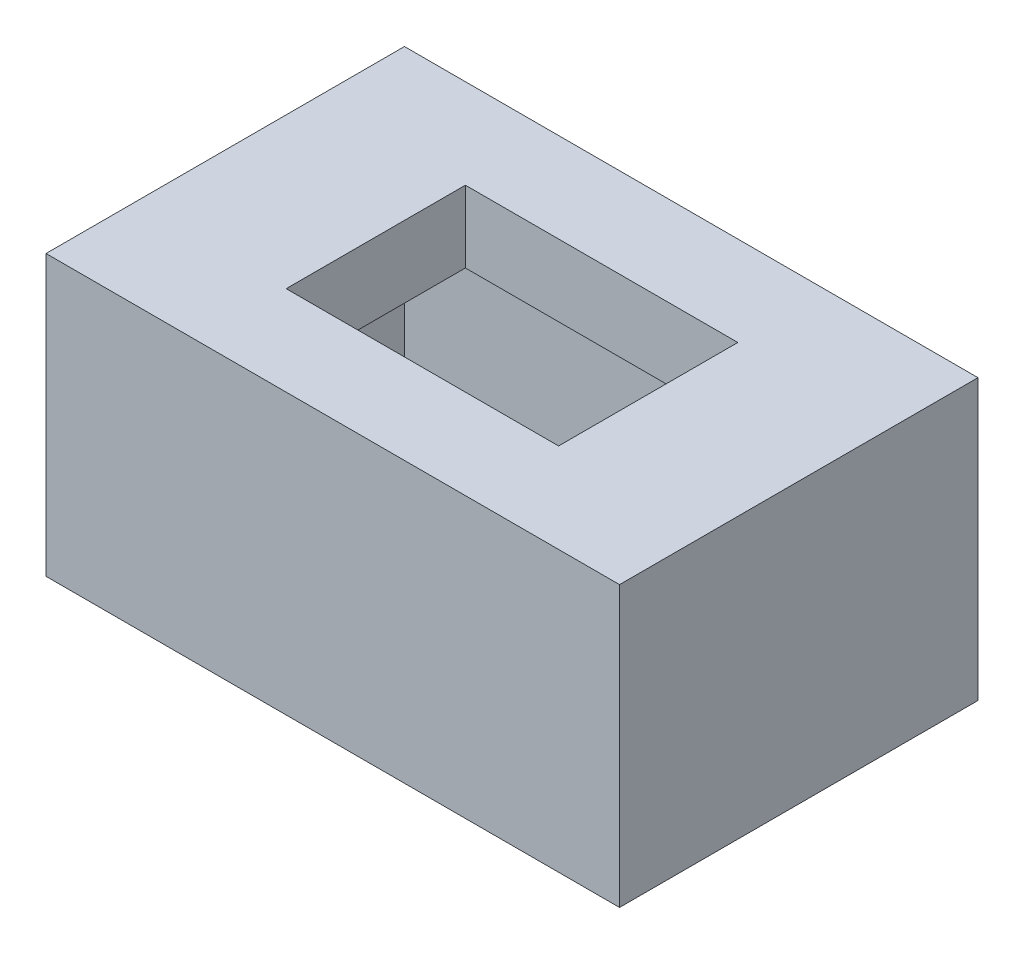
ISO-10303-21;
HEADER;
FILE_DESCRIPTION(('STEP AP214'),'2;1');
FILE_NAME('part.step','',(''),(''),'','','');
FILE_SCHEMA(('AUTOMOTIVE_DESIGN { 1 0 10303 214 1 1 1 1 }'));
ENDSEC;
DATA;
#1=APPLICATION_CONTEXT('core data for automotive mechanical design processes');
#2=APPLICATION_PROTOCOL_DEFINITION('international standard','automotive_design',2000,#1);
#3=PRODUCT_CONTEXT('',#1,'mechanical');
#4=PRODUCT('Part','Part','',(#3));
#5=PRODUCT_RELATED_PRODUCT_CATEGORY('part','',(#4));
#6=PRODUCT_DEFINITION_FORMATION('','',#4);
#7=PRODUCT_DEFINITION_CONTEXT('part definition',#1,'design');
#8=PRODUCT_DEFINITION('design','',#6,#7);
#9=PRODUCT_DEFINITION_SHAPE('','',#8);
#10=(LENGTH_UNIT() NAMED_UNIT(*) SI_UNIT(.MILLI.,.METRE.));
#11=(NAMED_UNIT(*) PLANE_ANGLE_UNIT() SI_UNIT($,.RADIAN.));
#12=(NAMED_UNIT(*) SI_UNIT($,.STERADIAN.) SOLID_ANGLE_UNIT());
#13=UNCERTAINTY_MEASURE_WITH_UNIT(LENGTH_MEASURE(1.E-05),#10,'distance_accuracy_value','');
#14=(GEOMETRIC_REPRESENTATION_CONTEXT(3) GLOBAL_UNCERTAINTY_ASSIGNED_CONTEXT((#13)) GLOBAL_UNIT_ASSIGNED_CONTEXT((#10,
#11,#12)) REPRESENTATION_CONTEXT('',''));
#15=CARTESIAN_POINT('',(0.,0.,0.));
#16=DIRECTION('',(0.,0.,1.));
#17=DIRECTION('',(1.,0.,0.));
#18=AXIS2_PLACEMENT_3D('',#15,#16,#17);
#19=CARTESIAN_POINT('',(40.,40.,-25.));
#20=DIRECTION('',(-1.,0.,0.));
#21=DIRECTION('',(0.,0.,1.));
#22=AXIS2_PLACEMENT_3D('',#19,#20,#21);
#23=PLANE('',#22);
#24=DIRECTION('',(0.,0.,1.));
#25=VECTOR('',#24,1.);
#26=CARTESIAN_POINT('',(40.,1.,-25.));
#27=LINE('',#26,#25);
#28=CARTESIAN_POINT('',(40.,1.,-25.));
#29=VERTEX_POINT('',#28);
#30=CARTESIAN_POINT('',(40.,1.,25.));
#31=VERTEX_POINT('',#30);
#32=EDGE_CURVE('E56',#29,#31,#27,.T.);
#33=ORIENTED_EDGE('',*,*,#32,.F.);
#34=DIRECTION('',(0.,-1.,0.));
#35=VECTOR('',#34,1.);
#36=CARTESIAN_POINT('',(40.,40.,-25.));
#37=LINE('',#36,#35);
#38=CARTESIAN_POINT('',(40.,40.,-25.));
#39=VERTEX_POINT('',#38);
#40=EDGE_CURVE('E313',#39,#29,#37,.T.);
#41=ORIENTED_EDGE('',*,*,#40,.F.);
#42=DIRECTION('',(0.,0.,-1.));
#43=VECTOR('',#42,1.);
#44=CARTESIAN_POINT('',(40.,40.,-25.));
#45=LINE('',#44,#43);
#46=CARTESIAN_POINT('',(40.,40.,25.));
#47=VERTEX_POINT('',#46);
#48=EDGE_CURVE('E279',#47,#39,#45,.T.);
#49=ORIENTED_EDGE('',*,*,#48,.F.);
#50=DIRECTION('',(0.,-1.,0.));
#51=VECTOR('',#50,1.);
#52=CARTESIAN_POINT('',(40.,40.,25.));
#53=LINE('',#52,#51);
#54=EDGE_CURVE('E301',#47,#31,#53,.T.);
#55=ORIENTED_EDGE('',*,*,#54,.T.);
#56=EDGE_LOOP('',(#33,#41,#49,#55));
#57=FACE_BOUND('',#56,.T.);
#58=ADVANCED_FACE('F41',(#57),#23,.F.);
#59=CARTESIAN_POINT('',(-40.,40.,-25.));
#60=DIRECTION('',(0.,0.,1.));
#61=DIRECTION('',(1.,0.,0.));
#62=AXIS2_PLACEMENT_3D('',#59,#60,#61);
#63=PLANE('',#62);
#64=DIRECTION('',(1.,0.,0.));
#65=VECTOR('',#64,1.);
#66=CARTESIAN_POINT('',(-40.,1.,-25.));
#67=LINE('',#66,#65);
#68=CARTESIAN_POINT('',(-40.,1.,-25.));
#69=VERTEX_POINT('',#68);
#70=EDGE_CURVE('E200',#69,#29,#67,.T.);
#71=ORIENTED_EDGE('',*,*,#70,.F.);
#72=DIRECTION('',(0.,-1.,0.));
#73=VECTOR('',#72,1.);
#74=CARTESIAN_POINT('',(-40.,40.,-25.));
#75=LINE('',#74,#73);
#76=CARTESIAN_POINT('',(-40.,40.,-25.));
#77=VERTEX_POINT('',#76);
#78=EDGE_CURVE('E309',#77,#69,#75,.T.);
#79=ORIENTED_EDGE('',*,*,#78,.F.);
#80=DIRECTION('',(-1.,0.,0.));
#81=VECTOR('',#80,1.);
#82=CARTESIAN_POINT('',(-40.,40.,-25.));
#83=LINE('',#82,#81);
#84=EDGE_CURVE('E292',#39,#77,#83,.T.);
#85=ORIENTED_EDGE('',*,*,#84,.F.);
#86=ORIENTED_EDGE('',*,*,#40,.T.);
#87=EDGE_LOOP('',(#71,#79,#85,#86));
#88=FACE_BOUND('',#87,.T.);
#89=ADVANCED_FACE('F361',(#88),#63,.F.);
#90=CARTESIAN_POINT('',(-40.,40.,-25.));
#91=DIRECTION('',(1.,0.,0.));
#92=DIRECTION('',(0.,0.,-1.));
#93=AXIS2_PLACEMENT_3D('',#90,#91,#92);
#94=PLANE('',#93);
#95=DIRECTION('',(0.,0.,-1.));
#96=VECTOR('',#95,1.);
#97=CARTESIAN_POINT('',(-40.,1.,25.));
#98=LINE('',#97,#96);
#99=CARTESIAN_POINT('',(-40.,1.,25.));
#100=VERTEX_POINT('',#99);
#101=EDGE_CURVE('E213',#100,#69,#98,.T.);
#102=ORIENTED_EDGE('',*,*,#101,.F.);
#103=DIRECTION('',(0.,-1.,0.));
#104=VECTOR('',#103,1.);
#105=CARTESIAN_POINT('',(-40.,40.,25.));
#106=LINE('',#105,#104);
#107=CARTESIAN_POINT('',(-40.,40.,25.));
#108=VERTEX_POINT('',#107);
#109=EDGE_CURVE('E305',#108,#100,#106,.T.);
#110=ORIENTED_EDGE('',*,*,#109,.F.);
#111=DIRECTION('',(0.,0.,1.));
#112=VECTOR('',#111,1.);
#113=CARTESIAN_POINT('',(-40.,40.,-25.));
#114=LINE('',#113,#112);
#115=EDGE_CURVE('E295',#77,#108,#114,.T.);
#116=ORIENTED_EDGE('',*,*,#115,.F.);
#117=ORIENTED_EDGE('',*,*,#78,.T.);
#118=EDGE_LOOP('',(#102,#110,#116,#117));
#119=FACE_BOUND('',#118,.T.);
#120=ADVANCED_FACE('F366',(#119),#94,.F.);
#121=CARTESIAN_POINT('',(-40.,40.,25.));
#122=DIRECTION('',(0.,0.,-1.));
#123=DIRECTION('',(-1.,0.,0.));
#124=AXIS2_PLACEMENT_3D('',#121,#122,#123);
#125=PLANE('',#124);
#126=DIRECTION('',(-1.,0.,0.));
#127=VECTOR('',#126,1.);
#128=CARTESIAN_POINT('',(40.,1.,25.));
#129=LINE('',#128,#127);
#130=EDGE_CURVE('E210',#31,#100,#129,.T.);
#131=ORIENTED_EDGE('',*,*,#130,.F.);
#132=ORIENTED_EDGE('',*,*,#54,.F.);
#133=DIRECTION('',(1.,0.,0.));
#134=VECTOR('',#133,1.);
#135=CARTESIAN_POINT('',(-40.,40.,25.));
#136=LINE('',#135,#134);
#137=EDGE_CURVE('E298',#108,#47,#136,.T.);
#138=ORIENTED_EDGE('',*,*,#137,.F.);
#139=ORIENTED_EDGE('',*,*,#109,.T.);
#140=EDGE_LOOP('',(#131,#132,#138,#139));
#141=FACE_BOUND('',#140,.T.);
#142=ADVANCED_FACE('F368',(#141),#125,.F.);
#143=CARTESIAN_POINT('',(0.,0.,0.));
#144=DIRECTION('',(0.,1.,0.));
#145=DIRECTION('',(0.,0.,1.));
#146=AXIS2_PLACEMENT_3D('',#143,#144,#145);
#147=PLANE('',#146);
#148=DIRECTION('',(0.,0.,1.));
#149=VECTOR('',#148,1.);
#150=CARTESIAN_POINT('',(35.,0.,-20.));
#151=LINE('',#150,#149);
#152=CARTESIAN_POINT('',(35.,0.,-20.));
#153=VERTEX_POINT('',#152);
#154=CARTESIAN_POINT('',(35.,0.,20.));
#155=VERTEX_POINT('',#154);
#156=EDGE_CURVE('E265',#153,#155,#151,.T.);
#157=ORIENTED_EDGE('',*,*,#156,.F.);
#158=DIRECTION('',(1.,0.,0.));
#159=VECTOR('',#158,1.);
#160=CARTESIAN_POINT('',(-35.,0.,-20.));
#161=LINE('',#160,#159);
#162=CARTESIAN_POINT('',(-35.,0.,-20.));
#163=VERTEX_POINT('',#162);
#164=EDGE_CURVE('E235',#163,#153,#161,.T.);
#165=ORIENTED_EDGE('',*,*,#164,.F.);
#166=DIRECTION('',(0.,0.,-1.));
#167=VECTOR('',#166,1.);
#168=CARTESIAN_POINT('',(-35.,0.,20.));
#169=LINE('',#168,#167);
#170=CARTESIAN_POINT('',(-35.,0.,20.));
#171=VERTEX_POINT('',#170);
#172=EDGE_CURVE('E250',#171,#163,#169,.T.);
#173=ORIENTED_EDGE('',*,*,#172,.F.);
#174=DIRECTION('',(-1.,0.,0.));
#175=VECTOR('',#174,1.);
#176=CARTESIAN_POINT('',(35.,0.,20.));
#177=LINE('',#176,#175);
#178=EDGE_CURVE('E269',#155,#171,#177,.T.);
#179=ORIENTED_EDGE('',*,*,#178,.F.);
#180=EDGE_LOOP('',(#157,#165,#173,#179));
#181=FACE_BOUND('',#180,.T.);
#182=DIRECTION('',(1.,0.,0.));
#183=VECTOR('',#182,1.);
#184=CARTESIAN_POINT('',(-37.5,0.,-22.5));
#185=LINE('',#184,#183);
#186=CARTESIAN_POINT('',(-37.5,0.,-22.5));
#187=VERTEX_POINT('',#186);
#188=CARTESIAN_POINT('',(37.5,0.,-22.5));
#189=VERTEX_POINT('',#188);
#190=EDGE_CURVE('E191',#187,#189,#185,.T.);
#191=ORIENTED_EDGE('',*,*,#190,.T.);
#192=DIRECTION('',(0.,0.,1.));
#193=VECTOR('',#192,1.);
#194=CARTESIAN_POINT('',(37.5,0.,-22.5));
#195=LINE('',#194,#193);
#196=CARTESIAN_POINT('',(37.5,0.,22.5));
#197=VERTEX_POINT('',#196);
#198=EDGE_CURVE('E159',#189,#197,#195,.T.);
#199=ORIENTED_EDGE('',*,*,#198,.T.);
#200=DIRECTION('',(-1.,0.,0.));
#201=VECTOR('',#200,1.);
#202=CARTESIAN_POINT('',(37.5,0.,22.5));
#203=LINE('',#202,#201);
#204=CARTESIAN_POINT('',(-37.5,0.,22.5));
#205=VERTEX_POINT('',#204);
#206=EDGE_CURVE('E64',#197,#205,#203,.T.);
#207=ORIENTED_EDGE('',*,*,#206,.T.);
#208=DIRECTION('',(0.,0.,-1.));
#209=VECTOR('',#208,1.);
#210=CARTESIAN_POINT('',(-37.5,0.,22.5));
#211=LINE('',#210,#209);
#212=EDGE_CURVE('E181',#205,#187,#211,.T.);
#213=ORIENTED_EDGE('',*,*,#212,.T.);
#214=EDGE_LOOP('',(#191,#199,#207,#213));
#215=FACE_BOUND('',#214,.T.);
#216=ADVANCED_FACE('F351',(#181,#215),#147,.F.);
#217=CARTESIAN_POINT('',(0.,40.,0.));
#218=DIRECTION('',(0.,1.,0.));
#219=DIRECTION('',(0.,0.,1.));
#220=AXIS2_PLACEMENT_3D('',#217,#218,#219);
#221=PLANE('',#220);
#222=DIRECTION('',(0.,0.,-1.));
#223=VECTOR('',#222,1.);
#224=CARTESIAN_POINT('',(19.,40.,12.5));
#225=LINE('',#224,#223);
#226=CARTESIAN_POINT('',(19.,40.,12.5));
#227=VERTEX_POINT('',#226);
#228=CARTESIAN_POINT('',(19.,40.,-12.5));
#229=VERTEX_POINT('',#228);
#230=EDGE_CURVE('E216',#227,#229,#225,.T.);
#231=ORIENTED_EDGE('',*,*,#230,.F.);
#232=DIRECTION('',(1.,0.,0.));
#233=VECTOR('',#232,1.);
#234=CARTESIAN_POINT('',(-19.,40.,12.5));
#235=LINE('',#234,#233);
#236=CARTESIAN_POINT('',(-19.,40.,12.5));
#237=VERTEX_POINT('',#236);
#238=EDGE_CURVE('E227',#237,#227,#235,.T.);
#239=ORIENTED_EDGE('',*,*,#238,.F.);
#240=DIRECTION('',(0.,0.,1.));
#241=VECTOR('',#240,1.);
#242=CARTESIAN_POINT('',(-19.,40.,12.5));
#243=LINE('',#242,#241);
#244=CARTESIAN_POINT('',(-19.,40.,-12.5));
#245=VERTEX_POINT('',#244);
#246=EDGE_CURVE('E223',#245,#237,#243,.T.);
#247=ORIENTED_EDGE('',*,*,#246,.F.);
#248=DIRECTION('',(-1.,0.,0.));
#249=VECTOR('',#248,1.);
#250=CARTESIAN_POINT('',(-19.,40.,-12.5));
#251=LINE('',#250,#249);
#252=EDGE_CURVE('E219',#229,#245,#251,.T.);
#253=ORIENTED_EDGE('',*,*,#252,.F.);
#254=EDGE_LOOP('',(#231,#239,#247,#253));
#255=FACE_BOUND('',#254,.T.);
#256=ORIENTED_EDGE('',*,*,#48,.T.);
#257=ORIENTED_EDGE('',*,*,#84,.T.);
#258=ORIENTED_EDGE('',*,*,#115,.T.);
#259=ORIENTED_EDGE('',*,*,#137,.T.);
#260=EDGE_LOOP('',(#256,#257,#258,#259));
#261=FACE_BOUND('',#260,.T.);
#262=ADVANCED_FACE('F347',(#255,#261),#221,.T.);
#263=CARTESIAN_POINT('',(-35.,30.,-20.));
#264=DIRECTION('',(0.,0.,-1.));
#265=DIRECTION('',(-1.,0.,0.));
#266=AXIS2_PLACEMENT_3D('',#263,#264,#265);
#267=PLANE('',#266);
#268=ORIENTED_EDGE('',*,*,#164,.T.);
#269=DIRECTION('',(0.,-1.,0.));
#270=VECTOR('',#269,1.);
#271=CARTESIAN_POINT('',(35.,30.,-20.));
#272=LINE('',#271,#270);
#273=CARTESIAN_POINT('',(35.,30.,-20.));
#274=VERTEX_POINT('',#273);
#275=EDGE_CURVE('E262',#274,#153,#272,.T.);
#276=ORIENTED_EDGE('',*,*,#275,.F.);
#277=DIRECTION('',(1.,0.,0.));
#278=VECTOR('',#277,1.);
#279=CARTESIAN_POINT('',(-35.,30.,-20.));
#280=LINE('',#279,#278);
#281=CARTESIAN_POINT('',(-35.,30.,-20.));
#282=VERTEX_POINT('',#281);
#283=EDGE_CURVE('E245',#282,#274,#280,.T.);
#284=ORIENTED_EDGE('',*,*,#283,.F.);
#285=DIRECTION('',(0.,-1.,0.));
#286=VECTOR('',#285,1.);
#287=CARTESIAN_POINT('',(-35.,30.,-20.));
#288=LINE('',#287,#286);
#289=EDGE_CURVE('E276',#282,#163,#288,.T.);
#290=ORIENTED_EDGE('',*,*,#289,.T.);
#291=EDGE_LOOP('',(#268,#276,#284,#290));
#292=FACE_BOUND('',#291,.T.);
#293=ADVANCED_FACE('F350',(#292),#267,.F.);
#294=CARTESIAN_POINT('',(-35.,30.,20.));
#295=DIRECTION('',(-1.,0.,0.));
#296=DIRECTION('',(0.,0.,1.));
#297=AXIS2_PLACEMENT_3D('',#294,#295,#296);
#298=PLANE('',#297);
#299=ORIENTED_EDGE('',*,*,#172,.T.);
#300=ORIENTED_EDGE('',*,*,#289,.F.);
#301=DIRECTION('',(0.,0.,-1.));
#302=VECTOR('',#301,1.);
#303=CARTESIAN_POINT('',(-35.,30.,20.));
#304=LINE('',#303,#302);
#305=CARTESIAN_POINT('',(-35.,30.,20.));
#306=VERTEX_POINT('',#305);
#307=EDGE_CURVE('E258',#306,#282,#304,.T.);
#308=ORIENTED_EDGE('',*,*,#307,.F.);
#309=DIRECTION('',(0.,-1.,0.));
#310=VECTOR('',#309,1.);
#311=CARTESIAN_POINT('',(-35.,30.,20.));
#312=LINE('',#311,#310);
#313=EDGE_CURVE('E280',#306,#171,#312,.T.);
#314=ORIENTED_EDGE('',*,*,#313,.T.);
#315=EDGE_LOOP('',(#299,#300,#308,#314));
#316=FACE_BOUND('',#315,.T.);
#317=ADVANCED_FACE('F395',(#316),#298,.F.);
#318=CARTESIAN_POINT('',(35.,30.,20.));
#319=DIRECTION('',(0.,0.,1.));
#320=DIRECTION('',(1.,0.,0.));
#321=AXIS2_PLACEMENT_3D('',#318,#319,#320);
#322=PLANE('',#321);
#323=ORIENTED_EDGE('',*,*,#178,.T.);
#324=ORIENTED_EDGE('',*,*,#313,.F.);
#325=DIRECTION('',(-1.,0.,0.));
#326=VECTOR('',#325,1.);
#327=CARTESIAN_POINT('',(35.,30.,20.));
#328=LINE('',#327,#326);
#329=CARTESIAN_POINT('',(35.,30.,20.));
#330=VERTEX_POINT('',#329);
#331=EDGE_CURVE('E254',#330,#306,#328,.T.);
#332=ORIENTED_EDGE('',*,*,#331,.F.);
#333=DIRECTION('',(0.,-1.,0.));
#334=VECTOR('',#333,1.);
#335=CARTESIAN_POINT('',(35.,30.,20.));
#336=LINE('',#335,#334);
#337=EDGE_CURVE('E283',#330,#155,#336,.T.);
#338=ORIENTED_EDGE('',*,*,#337,.T.);
#339=EDGE_LOOP('',(#323,#324,#332,#338));
#340=FACE_BOUND('',#339,.T.);
#341=ADVANCED_FACE('F400',(#340),#322,.F.);
#342=CARTESIAN_POINT('',(35.,30.,-20.));
#343=DIRECTION('',(1.,0.,0.));
#344=DIRECTION('',(0.,0.,-1.));
#345=AXIS2_PLACEMENT_3D('',#342,#343,#344);
#346=PLANE('',#345);
#347=ORIENTED_EDGE('',*,*,#156,.T.);
#348=ORIENTED_EDGE('',*,*,#337,.F.);
#349=DIRECTION('',(0.,0.,1.));
#350=VECTOR('',#349,1.);
#351=CARTESIAN_POINT('',(35.,30.,-20.));
#352=LINE('',#351,#350);
#353=EDGE_CURVE('E249',#274,#330,#352,.T.);
#354=ORIENTED_EDGE('',*,*,#353,.F.);
#355=ORIENTED_EDGE('',*,*,#275,.T.);
#356=EDGE_LOOP('',(#347,#348,#354,#355));
#357=FACE_BOUND('',#356,.T.);
#358=ADVANCED_FACE('F397',(#357),#346,.F.);
#359=CARTESIAN_POINT('',(0.,30.,0.));
#360=DIRECTION('',(0.,-1.,0.));
#361=DIRECTION('',(0.,0.,-1.));
#362=AXIS2_PLACEMENT_3D('',#359,#360,#361);
#363=PLANE('',#362);
#364=DIRECTION('',(0.,0.,1.));
#365=VECTOR('',#364,1.);
#366=CARTESIAN_POINT('',(19.,30.,0.));
#367=LINE('',#366,#365);
#368=CARTESIAN_POINT('',(19.,30.,-12.5));
#369=VERTEX_POINT('',#368);
#370=CARTESIAN_POINT('',(19.,30.,12.5));
#371=VERTEX_POINT('',#370);
#372=EDGE_CURVE('E11',#369,#371,#367,.T.);
#373=ORIENTED_EDGE('',*,*,#372,.F.);
#374=DIRECTION('',(1.,0.,0.));
#375=VECTOR('',#374,1.);
#376=CARTESIAN_POINT('',(0.,30.,-12.5));
#377=LINE('',#376,#375);
#378=CARTESIAN_POINT('',(-19.,30.,-12.5));
#379=VERTEX_POINT('',#378);
#380=EDGE_CURVE('E317',#379,#369,#377,.T.);
#381=ORIENTED_EDGE('',*,*,#380,.F.);
#382=DIRECTION('',(0.,0.,-1.));
#383=VECTOR('',#382,1.);
#384=CARTESIAN_POINT('',(-19.,30.,0.));
#385=LINE('',#384,#383);
#386=CARTESIAN_POINT('',(-19.,30.,12.5));
#387=VERTEX_POINT('',#386);
#388=EDGE_CURVE('E320',#387,#379,#385,.T.);
#389=ORIENTED_EDGE('',*,*,#388,.F.);
#390=DIRECTION('',(-1.,0.,0.));
#391=VECTOR('',#390,1.);
#392=CARTESIAN_POINT('',(0.,30.,12.5));
#393=LINE('',#392,#391);
#394=EDGE_CURVE('E49',#371,#387,#393,.T.);
#395=ORIENTED_EDGE('',*,*,#394,.F.);
#396=EDGE_LOOP('',(#373,#381,#389,#395));
#397=FACE_BOUND('',#396,.T.);
#398=ORIENTED_EDGE('',*,*,#283,.T.);
#399=ORIENTED_EDGE('',*,*,#353,.T.);
#400=ORIENTED_EDGE('',*,*,#331,.T.);
#401=ORIENTED_EDGE('',*,*,#307,.T.);
#402=EDGE_LOOP('',(#398,#399,#400,#401));
#403=FACE_BOUND('',#402,.T.);
#404=ADVANCED_FACE('F337',(#397,#403),#363,.T.);
#405=CARTESIAN_POINT('',(19.,10.,12.5));
#406=DIRECTION('',(1.,0.,0.));
#407=DIRECTION('',(0.,0.,-1.));
#408=AXIS2_PLACEMENT_3D('',#405,#406,#407);
#409=PLANE('',#408);
#410=ORIENTED_EDGE('',*,*,#372,.T.);
#411=DIRECTION('',(0.,1.,0.));
#412=VECTOR('',#411,1.);
#413=CARTESIAN_POINT('',(19.,10.,12.5));
#414=LINE('',#413,#412);
#415=EDGE_CURVE('E232',#371,#227,#414,.T.);
#416=ORIENTED_EDGE('',*,*,#415,.T.);
#417=ORIENTED_EDGE('',*,*,#230,.T.);
#418=DIRECTION('',(0.,1.,0.));
#419=VECTOR('',#418,1.);
#420=CARTESIAN_POINT('',(19.,10.,-12.5));
#421=LINE('',#420,#419);
#422=EDGE_CURVE('E231',#369,#229,#421,.T.);
#423=ORIENTED_EDGE('',*,*,#422,.F.);
#424=EDGE_LOOP('',(#410,#416,#417,#423));
#425=FACE_BOUND('',#424,.T.);
#426=ADVANCED_FACE('F344',(#425),#409,.F.);
#427=CARTESIAN_POINT('',(-19.,10.,12.5));
#428=DIRECTION('',(0.,0.,1.));
#429=DIRECTION('',(1.,0.,0.));
#430=AXIS2_PLACEMENT_3D('',#427,#428,#429);
#431=PLANE('',#430);
#432=ORIENTED_EDGE('',*,*,#394,.T.);
#433=DIRECTION('',(0.,1.,0.));
#434=VECTOR('',#433,1.);
#435=CARTESIAN_POINT('',(-19.,10.,12.5));
#436=LINE('',#435,#434);
#437=EDGE_CURVE('E236',#387,#237,#436,.T.);
#438=ORIENTED_EDGE('',*,*,#437,.T.);
#439=ORIENTED_EDGE('',*,*,#238,.T.);
#440=ORIENTED_EDGE('',*,*,#415,.F.);
#441=EDGE_LOOP('',(#432,#438,#439,#440));
#442=FACE_BOUND('',#441,.T.);
#443=ADVANCED_FACE('F328',(#442),#431,.F.);
#444=CARTESIAN_POINT('',(-19.,10.,12.5));
#445=DIRECTION('',(-1.,0.,0.));
#446=DIRECTION('',(0.,0.,1.));
#447=AXIS2_PLACEMENT_3D('',#444,#445,#446);
#448=PLANE('',#447);
#449=ORIENTED_EDGE('',*,*,#388,.T.);
#450=DIRECTION('',(0.,1.,0.));
#451=VECTOR('',#450,1.);
#452=CARTESIAN_POINT('',(-19.,10.,-12.5));
#453=LINE('',#452,#451);
#454=EDGE_CURVE('E239',#379,#245,#453,.T.);
#455=ORIENTED_EDGE('',*,*,#454,.T.);
#456=ORIENTED_EDGE('',*,*,#246,.T.);
#457=ORIENTED_EDGE('',*,*,#437,.F.);
#458=EDGE_LOOP('',(#449,#455,#456,#457));
#459=FACE_BOUND('',#458,.T.);
#460=ADVANCED_FACE('F333',(#459),#448,.F.);
#461=CARTESIAN_POINT('',(-19.,10.,-12.5));
#462=DIRECTION('',(0.,0.,-1.));
#463=DIRECTION('',(-1.,0.,0.));
#464=AXIS2_PLACEMENT_3D('',#461,#462,#463);
#465=PLANE('',#464);
#466=ORIENTED_EDGE('',*,*,#380,.T.);
#467=ORIENTED_EDGE('',*,*,#422,.T.);
#468=ORIENTED_EDGE('',*,*,#252,.T.);
#469=ORIENTED_EDGE('',*,*,#454,.F.);
#470=EDGE_LOOP('',(#466,#467,#468,#469));
#471=FACE_BOUND('',#470,.T.);
#472=ADVANCED_FACE('F341',(#471),#465,.F.);
#473=CARTESIAN_POINT('',(0.,1.,0.));
#474=DIRECTION('',(0.,-1.,0.));
#475=DIRECTION('',(0.,0.,-1.));
#476=AXIS2_PLACEMENT_3D('',#473,#474,#475);
#477=PLANE('',#476);
#478=DIRECTION('',(0.,0.,-1.));
#479=VECTOR('',#478,1.);
#480=CARTESIAN_POINT('',(-37.5,1.,22.5));
#481=LINE('',#480,#479);
#482=CARTESIAN_POINT('',(-37.5,1.,22.5));
#483=VERTEX_POINT('',#482);
#484=CARTESIAN_POINT('',(-37.5,1.,-22.5));
#485=VERTEX_POINT('',#484);
#486=EDGE_CURVE('E166',#483,#485,#481,.T.);
#487=ORIENTED_EDGE('',*,*,#486,.F.);
#488=DIRECTION('',(-1.,0.,0.));
#489=VECTOR('',#488,1.);
#490=CARTESIAN_POINT('',(37.5,1.,22.5));
#491=LINE('',#490,#489);
#492=CARTESIAN_POINT('',(37.5,1.,22.5));
#493=VERTEX_POINT('',#492);
#494=EDGE_CURVE('E175',#493,#483,#491,.T.);
#495=ORIENTED_EDGE('',*,*,#494,.F.);
#496=DIRECTION('',(0.,0.,1.));
#497=VECTOR('',#496,1.);
#498=CARTESIAN_POINT('',(37.5,1.,-22.5));
#499=LINE('',#498,#497);
#500=CARTESIAN_POINT('',(37.5,1.,-22.5));
#501=VERTEX_POINT('',#500);
#502=EDGE_CURVE('E157',#501,#493,#499,.T.);
#503=ORIENTED_EDGE('',*,*,#502,.F.);
#504=DIRECTION('',(1.,0.,0.));
#505=VECTOR('',#504,1.);
#506=CARTESIAN_POINT('',(-37.5,1.,-22.5));
#507=LINE('',#506,#505);
#508=EDGE_CURVE('E172',#485,#501,#507,.T.);
#509=ORIENTED_EDGE('',*,*,#508,.F.);
#510=EDGE_LOOP('',(#487,#495,#503,#509));
#511=FACE_BOUND('',#510,.T.);
#512=ORIENTED_EDGE('',*,*,#70,.T.);
#513=ORIENTED_EDGE('',*,*,#32,.T.);
#514=ORIENTED_EDGE('',*,*,#130,.T.);
#515=ORIENTED_EDGE('',*,*,#101,.T.);
#516=EDGE_LOOP('',(#512,#513,#514,#515));
#517=FACE_BOUND('',#516,.T.);
#518=ADVANCED_FACE('F171',(#511,#517),#477,.T.);
#519=CARTESIAN_POINT('',(-37.5,1.,-22.5));
#520=DIRECTION('',(0.,0.,-1.));
#521=DIRECTION('',(-1.,0.,0.));
#522=AXIS2_PLACEMENT_3D('',#519,#520,#521);
#523=PLANE('',#522);
#524=ORIENTED_EDGE('',*,*,#190,.F.);
#525=DIRECTION('',(0.,-1.,0.));
#526=VECTOR('',#525,1.);
#527=CARTESIAN_POINT('',(-37.5,1.,-22.5));
#528=LINE('',#527,#526);
#529=EDGE_CURVE('E179',#485,#187,#528,.T.);
#530=ORIENTED_EDGE('',*,*,#529,.F.);
#531=ORIENTED_EDGE('',*,*,#508,.T.);
#532=DIRECTION('',(0.,-1.,0.));
#533=VECTOR('',#532,1.);
#534=CARTESIAN_POINT('',(37.5,1.,-22.5));
#535=LINE('',#534,#533);
#536=EDGE_CURVE('E154',#501,#189,#535,.T.);
#537=ORIENTED_EDGE('',*,*,#536,.T.);
#538=EDGE_LOOP('',(#524,#530,#531,#537));
#539=FACE_BOUND('',#538,.T.);
#540=ADVANCED_FACE('F178',(#539),#523,.T.);
#541=CARTESIAN_POINT('',(-37.5,1.,22.5));
#542=DIRECTION('',(-1.,0.,0.));
#543=DIRECTION('',(0.,0.,1.));
#544=AXIS2_PLACEMENT_3D('',#541,#542,#543);
#545=PLANE('',#544);
#546=ORIENTED_EDGE('',*,*,#212,.F.);
#547=DIRECTION('',(0.,-1.,0.));
#548=VECTOR('',#547,1.);
#549=CARTESIAN_POINT('',(-37.5,1.,22.5));
#550=LINE('',#549,#548);
#551=EDGE_CURVE('E201',#483,#205,#550,.T.);
#552=ORIENTED_EDGE('',*,*,#551,.F.);
#553=ORIENTED_EDGE('',*,*,#486,.T.);
#554=ORIENTED_EDGE('',*,*,#529,.T.);
#555=EDGE_LOOP('',(#546,#552,#553,#554));
#556=FACE_BOUND('',#555,.T.);
#557=ADVANCED_FACE('F375',(#556),#545,.T.);
#558=CARTESIAN_POINT('',(37.5,1.,22.5));
#559=DIRECTION('',(0.,0.,1.));
#560=DIRECTION('',(1.,0.,0.));
#561=AXIS2_PLACEMENT_3D('',#558,#559,#560);
#562=PLANE('',#561);
#563=ORIENTED_EDGE('',*,*,#206,.F.);
#564=DIRECTION('',(0.,-1.,0.));
#565=VECTOR('',#564,1.);
#566=CARTESIAN_POINT('',(37.5,1.,22.5));
#567=LINE('',#566,#565);
#568=EDGE_CURVE('E165',#493,#197,#567,.T.);
#569=ORIENTED_EDGE('',*,*,#568,.F.);
#570=ORIENTED_EDGE('',*,*,#494,.T.);
#571=ORIENTED_EDGE('',*,*,#551,.T.);
#572=EDGE_LOOP('',(#563,#569,#570,#571));
#573=FACE_BOUND('',#572,.T.);
#574=ADVANCED_FACE('F476',(#573),#562,.T.);
#575=CARTESIAN_POINT('',(37.5,1.,-22.5));
#576=DIRECTION('',(1.,0.,0.));
#577=DIRECTION('',(0.,0.,-1.));
#578=AXIS2_PLACEMENT_3D('',#575,#576,#577);
#579=PLANE('',#578);
#580=ORIENTED_EDGE('',*,*,#198,.F.);
#581=ORIENTED_EDGE('',*,*,#536,.F.);
#582=ORIENTED_EDGE('',*,*,#502,.T.);
#583=ORIENTED_EDGE('',*,*,#568,.T.);
#584=EDGE_LOOP('',(#580,#581,#582,#583));
#585=FACE_BOUND('',#584,.T.);
#586=ADVANCED_FACE('F156',(#585),#579,.T.);
#587=CLOSED_SHELL('',(#58,#89,#120,#142,#216,#262,#293,#317,#341,#358,#404,#426,#443,#460,#472,
#518,#540,#557,#574,#586));
#588=MANIFOLD_SOLID_BREP('B2',#587);
#589=ADVANCED_BREP_SHAPE_REPRESENTATION('',(#18,#588),#14);
#590=SHAPE_DEFINITION_REPRESENTATION(#9,#589);
ENDSEC;
END-ISO-10303-21;
